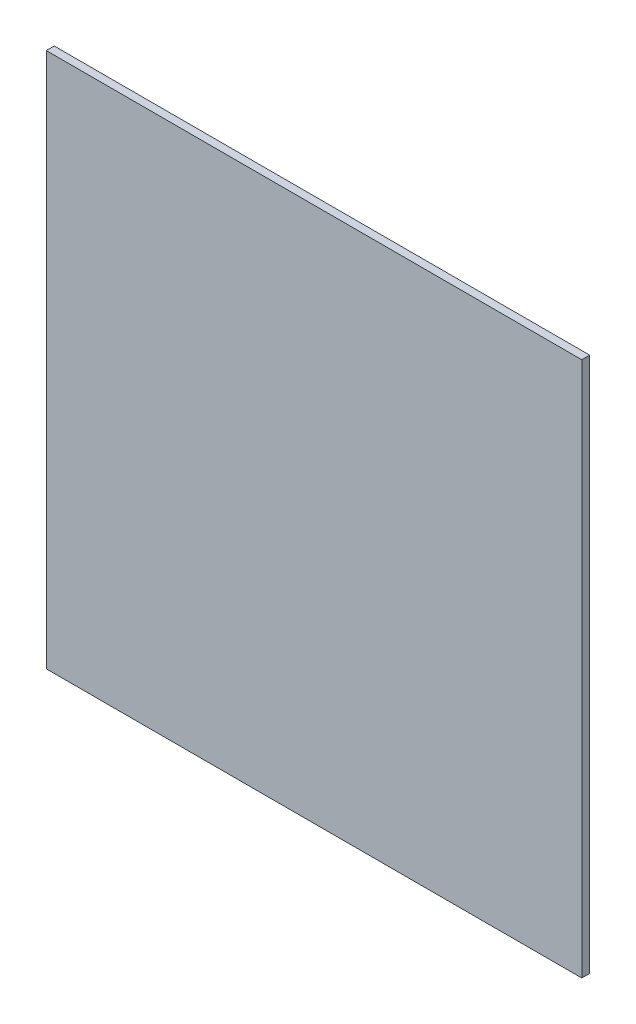
ISO-10303-21;
HEADER;
FILE_DESCRIPTION(('STEP AP214'),'2;1');
FILE_NAME('part.step','',(''),(''),'','','');
FILE_SCHEMA(('AUTOMOTIVE_DESIGN { 1 0 10303 214 1 1 1 1 }'));
ENDSEC;
DATA;
#1=APPLICATION_CONTEXT('core data for automotive mechanical design processes');
#2=APPLICATION_PROTOCOL_DEFINITION('international standard','automotive_design',2000,#1);
#3=PRODUCT_CONTEXT('',#1,'mechanical');
#4=PRODUCT('Part','Part','',(#3));
#5=PRODUCT_RELATED_PRODUCT_CATEGORY('part','',(#4));
#6=PRODUCT_DEFINITION_FORMATION('','',#4);
#7=PRODUCT_DEFINITION_CONTEXT('part definition',#1,'design');
#8=PRODUCT_DEFINITION('design','',#6,#7);
#9=PRODUCT_DEFINITION_SHAPE('','',#8);
#10=(LENGTH_UNIT() NAMED_UNIT(*) SI_UNIT(.MILLI.,.METRE.));
#11=(NAMED_UNIT(*) PLANE_ANGLE_UNIT() SI_UNIT($,.RADIAN.));
#12=(NAMED_UNIT(*) SI_UNIT($,.STERADIAN.) SOLID_ANGLE_UNIT());
#13=UNCERTAINTY_MEASURE_WITH_UNIT(LENGTH_MEASURE(1.E-05),#10,'distance_accuracy_value','');
#14=(GEOMETRIC_REPRESENTATION_CONTEXT(3) GLOBAL_UNCERTAINTY_ASSIGNED_CONTEXT((#13)) GLOBAL_UNIT_ASSIGNED_CONTEXT((#10,
#11,#12)) REPRESENTATION_CONTEXT('',''));
#15=CARTESIAN_POINT('',(0.,0.,0.));
#16=DIRECTION('',(0.,0.,1.));
#17=DIRECTION('',(1.,0.,0.));
#18=AXIS2_PLACEMENT_3D('',#15,#16,#17);
#19=CARTESIAN_POINT('',(0.,0.,0.4));
#20=DIRECTION('',(1.,0.,0.));
#21=DIRECTION('',(0.,0.,-1.));
#22=AXIS2_PLACEMENT_3D('',#19,#20,#21);
#23=PLANE('',#22);
#24=DIRECTION('',(0.,-1.,0.));
#25=VECTOR('',#24,1.);
#26=CARTESIAN_POINT('',(0.,0.,0.));
#27=LINE('',#26,#25);
#28=CARTESIAN_POINT('',(0.,27.,0.));
#29=VERTEX_POINT('',#28);
#30=CARTESIAN_POINT('',(0.,0.,0.));
#31=VERTEX_POINT('',#30);
#32=EDGE_CURVE('E105',#29,#31,#27,.T.);
#33=ORIENTED_EDGE('',*,*,#32,.T.);
#34=DIRECTION('',(0.,0.,-1.));
#35=VECTOR('',#34,1.);
#36=CARTESIAN_POINT('',(0.,0.,0.4));
#37=LINE('',#36,#35);
#38=CARTESIAN_POINT('',(0.,0.,0.4));
#39=VERTEX_POINT('',#38);
#40=EDGE_CURVE('E11',#39,#31,#37,.T.);
#41=ORIENTED_EDGE('',*,*,#40,.F.);
#42=DIRECTION('',(0.,-1.,0.));
#43=VECTOR('',#42,1.);
#44=CARTESIAN_POINT('',(0.,0.,0.4));
#45=LINE('',#44,#43);
#46=CARTESIAN_POINT('',(0.,27.,0.4));
#47=VERTEX_POINT('',#46);
#48=EDGE_CURVE('E89',#47,#39,#45,.T.);
#49=ORIENTED_EDGE('',*,*,#48,.F.);
#50=DIRECTION('',(0.,0.,-1.));
#51=VECTOR('',#50,1.);
#52=CARTESIAN_POINT('',(0.,27.,0.4));
#53=LINE('',#52,#51);
#54=EDGE_CURVE('E97',#47,#29,#53,.T.);
#55=ORIENTED_EDGE('',*,*,#54,.T.);
#56=EDGE_LOOP('',(#33,#41,#49,#55));
#57=FACE_BOUND('',#56,.T.);
#58=ADVANCED_FACE('F39',(#57),#23,.F.);
#59=CARTESIAN_POINT('',(0.,0.,0.4));
#60=DIRECTION('',(0.,1.,0.));
#61=DIRECTION('',(0.,0.,1.));
#62=AXIS2_PLACEMENT_3D('',#59,#60,#61);
#63=PLANE('',#62);
#64=DIRECTION('',(1.,0.,0.));
#65=VECTOR('',#64,1.);
#66=CARTESIAN_POINT('',(0.,0.,0.));
#67=LINE('',#66,#65);
#68=CARTESIAN_POINT('',(27.,0.,0.));
#69=VERTEX_POINT('',#68);
#70=EDGE_CURVE('E92',#31,#69,#67,.T.);
#71=ORIENTED_EDGE('',*,*,#70,.T.);
#72=DIRECTION('',(0.,0.,-1.));
#73=VECTOR('',#72,1.);
#74=CARTESIAN_POINT('',(27.,0.,0.4));
#75=LINE('',#74,#73);
#76=CARTESIAN_POINT('',(27.,0.,0.4));
#77=VERTEX_POINT('',#76);
#78=EDGE_CURVE('E50',#77,#69,#75,.T.);
#79=ORIENTED_EDGE('',*,*,#78,.F.);
#80=DIRECTION('',(1.,0.,0.));
#81=VECTOR('',#80,1.);
#82=CARTESIAN_POINT('',(0.,0.,0.4));
#83=LINE('',#82,#81);
#84=EDGE_CURVE('E82',#39,#77,#83,.T.);
#85=ORIENTED_EDGE('',*,*,#84,.F.);
#86=ORIENTED_EDGE('',*,*,#40,.T.);
#87=EDGE_LOOP('',(#71,#79,#85,#86));
#88=FACE_BOUND('',#87,.T.);
#89=ADVANCED_FACE('F93',(#88),#63,.F.);
#90=CARTESIAN_POINT('',(27.,0.,0.4));
#91=DIRECTION('',(-1.,0.,0.));
#92=DIRECTION('',(0.,0.,1.));
#93=AXIS2_PLACEMENT_3D('',#90,#91,#92);
#94=PLANE('',#93);
#95=DIRECTION('',(0.,1.,0.));
#96=VECTOR('',#95,1.);
#97=CARTESIAN_POINT('',(27.,0.,0.));
#98=LINE('',#97,#96);
#99=CARTESIAN_POINT('',(27.,27.,0.));
#100=VERTEX_POINT('',#99);
#101=EDGE_CURVE('E72',#69,#100,#98,.T.);
#102=ORIENTED_EDGE('',*,*,#101,.T.);
#103=DIRECTION('',(0.,0.,-1.));
#104=VECTOR('',#103,1.);
#105=CARTESIAN_POINT('',(27.,27.,0.4));
#106=LINE('',#105,#104);
#107=CARTESIAN_POINT('',(27.,27.,0.4));
#108=VERTEX_POINT('',#107);
#109=EDGE_CURVE('E94',#108,#100,#106,.T.);
#110=ORIENTED_EDGE('',*,*,#109,.F.);
#111=DIRECTION('',(0.,1.,0.));
#112=VECTOR('',#111,1.);
#113=CARTESIAN_POINT('',(27.,0.,0.4));
#114=LINE('',#113,#112);
#115=EDGE_CURVE('E88',#77,#108,#114,.T.);
#116=ORIENTED_EDGE('',*,*,#115,.F.);
#117=ORIENTED_EDGE('',*,*,#78,.T.);
#118=EDGE_LOOP('',(#102,#110,#116,#117));
#119=FACE_BOUND('',#118,.T.);
#120=ADVANCED_FACE('F96',(#119),#94,.F.);
#121=CARTESIAN_POINT('',(0.,27.,0.4));
#122=DIRECTION('',(0.,-1.,0.));
#123=DIRECTION('',(0.,0.,-1.));
#124=AXIS2_PLACEMENT_3D('',#121,#122,#123);
#125=PLANE('',#124);
#126=DIRECTION('',(-1.,0.,0.));
#127=VECTOR('',#126,1.);
#128=CARTESIAN_POINT('',(0.,27.,0.));
#129=LINE('',#128,#127);
#130=EDGE_CURVE('E76',#100,#29,#129,.T.);
#131=ORIENTED_EDGE('',*,*,#130,.T.);
#132=ORIENTED_EDGE('',*,*,#54,.F.);
#133=DIRECTION('',(-1.,0.,0.));
#134=VECTOR('',#133,1.);
#135=CARTESIAN_POINT('',(0.,27.,0.4));
#136=LINE('',#135,#134);
#137=EDGE_CURVE('E54',#108,#47,#136,.T.);
#138=ORIENTED_EDGE('',*,*,#137,.F.);
#139=ORIENTED_EDGE('',*,*,#109,.T.);
#140=EDGE_LOOP('',(#131,#132,#138,#139));
#141=FACE_BOUND('',#140,.T.);
#142=ADVANCED_FACE('F108',(#141),#125,.F.);
#143=CARTESIAN_POINT('',(0.,0.,0.4));
#144=DIRECTION('',(0.,0.,-1.));
#145=DIRECTION('',(-1.,0.,0.));
#146=AXIS2_PLACEMENT_3D('',#143,#144,#145);
#147=PLANE('',#146);
#148=ORIENTED_EDGE('',*,*,#48,.T.);
#149=ORIENTED_EDGE('',*,*,#84,.T.);
#150=ORIENTED_EDGE('',*,*,#115,.T.);
#151=ORIENTED_EDGE('',*,*,#137,.T.);
#152=EDGE_LOOP('',(#148,#149,#150,#151));
#153=FACE_BOUND('',#152,.T.);
#154=ADVANCED_FACE('F86',(#153),#147,.F.);
#155=CARTESIAN_POINT('',(0.,0.,0.));
#156=DIRECTION('',(0.,0.,-1.));
#157=DIRECTION('',(-1.,0.,0.));
#158=AXIS2_PLACEMENT_3D('',#155,#156,#157);
#159=PLANE('',#158);
#160=ORIENTED_EDGE('',*,*,#32,.F.);
#161=ORIENTED_EDGE('',*,*,#130,.F.);
#162=ORIENTED_EDGE('',*,*,#101,.F.);
#163=ORIENTED_EDGE('',*,*,#70,.F.);
#164=EDGE_LOOP('',(#160,#161,#162,#163));
#165=FACE_BOUND('',#164,.T.);
#166=ADVANCED_FACE('F115',(#165),#159,.T.);
#167=CLOSED_SHELL('',(#58,#89,#120,#142,#154,#166));
#168=MANIFOLD_SOLID_BREP('B2',#167);
#169=ADVANCED_BREP_SHAPE_REPRESENTATION('',(#18,#168),#14);
#170=SHAPE_DEFINITION_REPRESENTATION(#9,#169);
ENDSEC;
END-ISO-10303-21;
